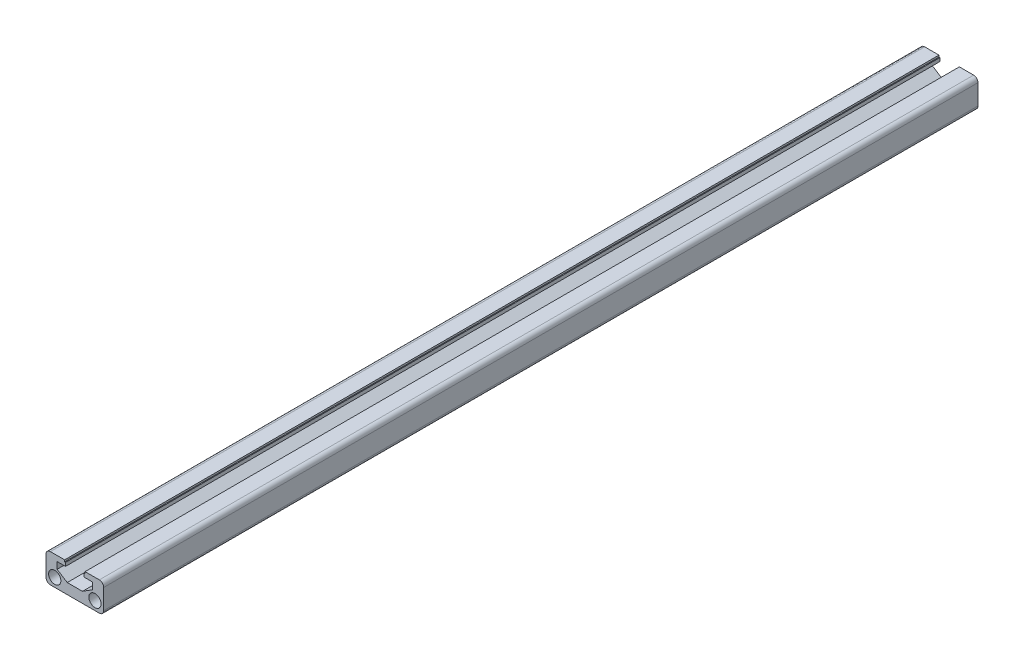
ISO-10303-21;
HEADER;
FILE_DESCRIPTION(('STEP AP214'),'2;1');
FILE_NAME('part.step','',(''),(''),'','','');
FILE_SCHEMA(('AUTOMOTIVE_DESIGN { 1 0 10303 214 1 1 1 1 }'));
ENDSEC;
DATA;
#1=APPLICATION_CONTEXT('core data for automotive mechanical design processes');
#2=APPLICATION_PROTOCOL_DEFINITION('international standard','automotive_design',2000,#1);
#3=PRODUCT_CONTEXT('',#1,'mechanical');
#4=PRODUCT('Part','Part','',(#3));
#5=PRODUCT_RELATED_PRODUCT_CATEGORY('part','',(#4));
#6=PRODUCT_DEFINITION_FORMATION('','',#4);
#7=PRODUCT_DEFINITION_CONTEXT('part definition',#1,'design');
#8=PRODUCT_DEFINITION('design','',#6,#7);
#9=PRODUCT_DEFINITION_SHAPE('','',#8);
#10=(LENGTH_UNIT() NAMED_UNIT(*) SI_UNIT(.MILLI.,.METRE.));
#11=(NAMED_UNIT(*) PLANE_ANGLE_UNIT() SI_UNIT($,.RADIAN.));
#12=(NAMED_UNIT(*) SI_UNIT($,.STERADIAN.) SOLID_ANGLE_UNIT());
#13=UNCERTAINTY_MEASURE_WITH_UNIT(LENGTH_MEASURE(1.E-05),#10,'distance_accuracy_value','');
#14=(GEOMETRIC_REPRESENTATION_CONTEXT(3) GLOBAL_UNCERTAINTY_ASSIGNED_CONTEXT((#13)) GLOBAL_UNIT_ASSIGNED_CONTEXT((#10,
#11,#12)) REPRESENTATION_CONTEXT('',''));
#15=CARTESIAN_POINT('',(0.,0.,0.));
#16=DIRECTION('',(0.,0.,1.));
#17=DIRECTION('',(1.,0.,0.));
#18=AXIS2_PLACEMENT_3D('',#15,#16,#17);
#19=CARTESIAN_POINT('',(8.4,3.45,300.));
#20=DIRECTION('',(0.,0.,-1.));
#21=DIRECTION('',(-1.,0.,0.));
#22=AXIS2_PLACEMENT_3D('',#19,#20,#21);
#23=PLANE('',#22);
#24=DIRECTION('',(-0.844508578449678,0.535542025358332,0.));
#25=VECTOR('',#24,1.);
#26=CARTESIAN_POINT('',(-6.07478831126901,0.842971246006387,300.));
#27=LINE('',#26,#25);
#28=CARTESIAN_POINT('',(-2.61664134641278,-1.35,300.));
#29=VERTEX_POINT('',#28);
#30=CARTESIAN_POINT('',(-6.07478831126901,0.842971246006387,300.));
#31=VERTEX_POINT('',#30);
#32=EDGE_CURVE('E294',#29,#31,#27,.T.);
#33=ORIENTED_EDGE('',*,*,#32,.T.);
#34=DIRECTION('',(0.,1.,0.));
#35=VECTOR('',#34,1.);
#36=CARTESIAN_POINT('',(-6.07478831126901,3.15000000000001,300.));
#37=LINE('',#36,#35);
#38=CARTESIAN_POINT('',(-6.07478831126901,3.15000000000001,300.));
#39=VERTEX_POINT('',#38);
#40=EDGE_CURVE('E146',#31,#39,#37,.T.);
#41=ORIENTED_EDGE('',*,*,#40,.T.);
#42=DIRECTION('',(1.,0.,0.));
#43=VECTOR('',#42,1.);
#44=CARTESIAN_POINT('',(-3.2,3.15000000000001,300.));
#45=LINE('',#44,#43);
#46=CARTESIAN_POINT('',(-3.2,3.15000000000001,300.));
#47=VERTEX_POINT('',#46);
#48=EDGE_CURVE('E371',#39,#47,#45,.T.);
#49=ORIENTED_EDGE('',*,*,#48,.T.);
#50=DIRECTION('',(0.,1.,0.));
#51=VECTOR('',#50,1.);
#52=CARTESIAN_POINT('',(-3.2,4.33849840255591,300.));
#53=LINE('',#52,#51);
#54=CARTESIAN_POINT('',(-3.2,4.33849840255591,300.));
#55=VERTEX_POINT('',#54);
#56=EDGE_CURVE('E391',#47,#55,#53,.T.);
#57=ORIENTED_EDGE('',*,*,#56,.T.);
#58=DIRECTION('',(-1.,0.,0.));
#59=VECTOR('',#58,1.);
#60=CARTESIAN_POINT('',(-3.5,4.33849840255591,300.));
#61=LINE('',#60,#59);
#62=CARTESIAN_POINT('',(-3.5,4.33849840255591,300.));
#63=VERTEX_POINT('',#62);
#64=EDGE_CURVE('E387',#55,#63,#61,.T.);
#65=ORIENTED_EDGE('',*,*,#64,.T.);
#66=DIRECTION('',(0.,1.,0.));
#67=VECTOR('',#66,1.);
#68=CARTESIAN_POINT('',(-3.5,4.95,300.));
#69=LINE('',#68,#67);
#70=CARTESIAN_POINT('',(-3.5,4.95,300.));
#71=VERTEX_POINT('',#70);
#72=EDGE_CURVE('E390',#63,#71,#69,.T.);
#73=ORIENTED_EDGE('',*,*,#72,.T.);
#74=DIRECTION('',(-1.,0.,0.));
#75=VECTOR('',#74,1.);
#76=CARTESIAN_POINT('',(-8.39999999999999,4.95,300.));
#77=LINE('',#76,#75);
#78=CARTESIAN_POINT('',(-8.39999999999999,4.95,300.));
#79=VERTEX_POINT('',#78);
#80=EDGE_CURVE('E395',#71,#79,#77,.T.);
#81=ORIENTED_EDGE('',*,*,#80,.T.);
#82=CARTESIAN_POINT('',(-8.4,3.45,300.));
#83=DIRECTION('',(0.,0.,1.));
#84=DIRECTION('',(-1.,0.,0.));
#85=AXIS2_PLACEMENT_3D('',#82,#83,#84);
#86=CIRCLE('',#85,1.5);
#87=CARTESIAN_POINT('',(-9.9,3.44999999999999,300.));
#88=VERTEX_POINT('',#87);
#89=EDGE_CURVE('E402',#79,#88,#86,.T.);
#90=ORIENTED_EDGE('',*,*,#89,.T.);
#91=DIRECTION('',(0.,-1.,0.));
#92=VECTOR('',#91,1.);
#93=CARTESIAN_POINT('',(-9.9,-3.44999999999999,300.));
#94=LINE('',#93,#92);
#95=CARTESIAN_POINT('',(-9.9,-3.44999999999999,300.));
#96=VERTEX_POINT('',#95);
#97=EDGE_CURVE('E405',#88,#96,#94,.T.);
#98=ORIENTED_EDGE('',*,*,#97,.T.);
#99=CARTESIAN_POINT('',(-8.4,-3.45,300.));
#100=DIRECTION('',(0.,0.,1.));
#101=DIRECTION('',(-1.,0.,0.));
#102=AXIS2_PLACEMENT_3D('',#99,#100,#101);
#103=CIRCLE('',#102,1.5);
#104=CARTESIAN_POINT('',(-8.39999999999999,-4.95,300.));
#105=VERTEX_POINT('',#104);
#106=EDGE_CURVE('E408',#96,#105,#103,.T.);
#107=ORIENTED_EDGE('',*,*,#106,.T.);
#108=DIRECTION('',(1.,0.,0.));
#109=VECTOR('',#108,1.);
#110=CARTESIAN_POINT('',(8.39999999999999,-4.95,300.));
#111=LINE('',#110,#109);
#112=CARTESIAN_POINT('',(8.39999999999999,-4.95,300.));
#113=VERTEX_POINT('',#112);
#114=EDGE_CURVE('E411',#105,#113,#111,.T.);
#115=ORIENTED_EDGE('',*,*,#114,.T.);
#116=CARTESIAN_POINT('',(8.4,-3.45,300.));
#117=DIRECTION('',(0.,0.,1.));
#118=DIRECTION('',(-1.,0.,0.));
#119=AXIS2_PLACEMENT_3D('',#116,#117,#118);
#120=CIRCLE('',#119,1.5);
#121=CARTESIAN_POINT('',(9.9,-3.44999999999999,300.));
#122=VERTEX_POINT('',#121);
#123=EDGE_CURVE('E414',#113,#122,#120,.T.);
#124=ORIENTED_EDGE('',*,*,#123,.T.);
#125=DIRECTION('',(0.,1.,0.));
#126=VECTOR('',#125,1.);
#127=CARTESIAN_POINT('',(9.9,-3.44999999999999,300.));
#128=LINE('',#127,#126);
#129=CARTESIAN_POINT('',(9.9,3.44999999999999,300.));
#130=VERTEX_POINT('',#129);
#131=EDGE_CURVE('E417',#122,#130,#128,.T.);
#132=ORIENTED_EDGE('',*,*,#131,.T.);
#133=CARTESIAN_POINT('',(8.4,3.45,300.));
#134=DIRECTION('',(0.,0.,1.));
#135=DIRECTION('',(-1.,0.,0.));
#136=AXIS2_PLACEMENT_3D('',#133,#134,#135);
#137=CIRCLE('',#136,1.5);
#138=CARTESIAN_POINT('',(8.39999999999999,4.95,300.));
#139=VERTEX_POINT('',#138);
#140=EDGE_CURVE('E420',#130,#139,#137,.T.);
#141=ORIENTED_EDGE('',*,*,#140,.T.);
#142=DIRECTION('',(-1.,0.,0.));
#143=VECTOR('',#142,1.);
#144=CARTESIAN_POINT('',(8.39999999999999,4.95,300.));
#145=LINE('',#144,#143);
#146=CARTESIAN_POINT('',(3.5,4.95,300.));
#147=VERTEX_POINT('',#146);
#148=EDGE_CURVE('E423',#139,#147,#145,.T.);
#149=ORIENTED_EDGE('',*,*,#148,.T.);
#150=DIRECTION('',(0.,-1.,0.));
#151=VECTOR('',#150,1.);
#152=CARTESIAN_POINT('',(3.5,4.95,300.));
#153=LINE('',#152,#151);
#154=CARTESIAN_POINT('',(3.5,4.33849840255591,300.));
#155=VERTEX_POINT('',#154);
#156=EDGE_CURVE('E426',#147,#155,#153,.T.);
#157=ORIENTED_EDGE('',*,*,#156,.T.);
#158=DIRECTION('',(-1.,0.,0.));
#159=VECTOR('',#158,1.);
#160=CARTESIAN_POINT('',(3.5,4.33849840255591,300.));
#161=LINE('',#160,#159);
#162=CARTESIAN_POINT('',(3.2,4.33849840255591,300.));
#163=VERTEX_POINT('',#162);
#164=EDGE_CURVE('E429',#155,#163,#161,.T.);
#165=ORIENTED_EDGE('',*,*,#164,.T.);
#166=DIRECTION('',(0.,-1.,0.));
#167=VECTOR('',#166,1.);
#168=CARTESIAN_POINT('',(3.2,4.33849840255591,300.));
#169=LINE('',#168,#167);
#170=CARTESIAN_POINT('',(3.2,3.15000000000001,300.));
#171=VERTEX_POINT('',#170);
#172=EDGE_CURVE('E432',#163,#171,#169,.T.);
#173=ORIENTED_EDGE('',*,*,#172,.T.);
#174=DIRECTION('',(1.,0.,0.));
#175=VECTOR('',#174,1.);
#176=CARTESIAN_POINT('',(3.2,3.15000000000001,300.));
#177=LINE('',#176,#175);
#178=CARTESIAN_POINT('',(6.07478831126901,3.15000000000001,300.));
#179=VERTEX_POINT('',#178);
#180=EDGE_CURVE('E207',#171,#179,#177,.T.);
#181=ORIENTED_EDGE('',*,*,#180,.T.);
#182=DIRECTION('',(0.,-1.,0.));
#183=VECTOR('',#182,1.);
#184=CARTESIAN_POINT('',(6.07478831126901,3.15000000000001,300.));
#185=LINE('',#184,#183);
#186=CARTESIAN_POINT('',(6.07478831126901,0.842971246006387,300.));
#187=VERTEX_POINT('',#186);
#188=EDGE_CURVE('E201',#179,#187,#185,.T.);
#189=ORIENTED_EDGE('',*,*,#188,.T.);
#190=DIRECTION('',(-0.844508578449678,-0.535542025358332,0.));
#191=VECTOR('',#190,1.);
#192=CARTESIAN_POINT('',(6.07478831126901,0.842971246006387,300.));
#193=LINE('',#192,#191);
#194=CARTESIAN_POINT('',(2.61664134641278,-1.35,300.));
#195=VERTEX_POINT('',#194);
#196=EDGE_CURVE('E205',#187,#195,#193,.T.);
#197=ORIENTED_EDGE('',*,*,#196,.T.);
#198=DIRECTION('',(-1.,0.,0.));
#199=VECTOR('',#198,1.);
#200=CARTESIAN_POINT('',(-2.61664134641278,-1.35,300.));
#201=LINE('',#200,#199);
#202=EDGE_CURVE('E61',#195,#29,#201,.T.);
#203=ORIENTED_EDGE('',*,*,#202,.T.);
#204=EDGE_LOOP('',(#33,#41,#49,#57,#65,#73,#81,#90,#98,#107,#115,#124,#132,#141,#149,#157,#165,
#173,#181,#189,#197,#203));
#205=FACE_BOUND('',#204,.T.);
#206=CARTESIAN_POINT('',(-6.9,-1.95,300.));
#207=DIRECTION('',(0.,0.,1.));
#208=DIRECTION('',(1.,0.,0.));
#209=AXIS2_PLACEMENT_3D('',#206,#207,#208);
#210=CIRCLE('',#209,2.1);
#211=CARTESIAN_POINT('',(-4.8,-1.95,300.));
#212=VERTEX_POINT('',#211);
#213=EDGE_CURVE('E234',#212,#212,#210,.T.);
#214=ORIENTED_EDGE('',*,*,#213,.F.);
#215=EDGE_LOOP('',(#214));
#216=FACE_BOUND('',#215,.T.);
#217=CARTESIAN_POINT('',(6.9,-1.95,300.));
#218=DIRECTION('',(0.,0.,1.));
#219=DIRECTION('',(-1.,0.,0.));
#220=AXIS2_PLACEMENT_3D('',#217,#218,#219);
#221=CIRCLE('',#220,2.1);
#222=CARTESIAN_POINT('',(4.8,-1.95,300.));
#223=VERTEX_POINT('',#222);
#224=EDGE_CURVE('E475',#223,#223,#221,.T.);
#225=ORIENTED_EDGE('',*,*,#224,.F.);
#226=EDGE_LOOP('',(#225));
#227=FACE_BOUND('',#226,.T.);
#228=ADVANCED_FACE('F43',(#205,#216,#227),#23,.F.);
#229=CARTESIAN_POINT('',(8.4,3.45,0.));
#230=DIRECTION('',(0.,0.,-1.));
#231=DIRECTION('',(-1.,0.,0.));
#232=AXIS2_PLACEMENT_3D('',#229,#230,#231);
#233=PLANE('',#232);
#234=CARTESIAN_POINT('',(-6.9,-1.95,0.));
#235=DIRECTION('',(0.,0.,1.));
#236=DIRECTION('',(1.,0.,0.));
#237=AXIS2_PLACEMENT_3D('',#234,#235,#236);
#238=CIRCLE('',#237,2.1);
#239=CARTESIAN_POINT('',(-4.8,-1.95,0.));
#240=VERTEX_POINT('',#239);
#241=EDGE_CURVE('E482',#240,#240,#238,.T.);
#242=ORIENTED_EDGE('',*,*,#241,.T.);
#243=EDGE_LOOP('',(#242));
#244=FACE_BOUND('',#243,.T.);
#245=DIRECTION('',(-0.844508578449678,0.535542025358332,0.));
#246=VECTOR('',#245,1.);
#247=CARTESIAN_POINT('',(-6.07478831126901,0.842971246006387,0.));
#248=LINE('',#247,#246);
#249=CARTESIAN_POINT('',(-2.61664134641278,-1.35,0.));
#250=VERTEX_POINT('',#249);
#251=CARTESIAN_POINT('',(-6.07478831126901,0.842971246006387,0.));
#252=VERTEX_POINT('',#251);
#253=EDGE_CURVE('E229',#250,#252,#248,.T.);
#254=ORIENTED_EDGE('',*,*,#253,.F.);
#255=DIRECTION('',(-1.,0.,0.));
#256=VECTOR('',#255,1.);
#257=CARTESIAN_POINT('',(-2.61664134641278,-1.35,0.));
#258=LINE('',#257,#256);
#259=CARTESIAN_POINT('',(2.61664134641278,-1.35,0.));
#260=VERTEX_POINT('',#259);
#261=EDGE_CURVE('E138',#260,#250,#258,.T.);
#262=ORIENTED_EDGE('',*,*,#261,.F.);
#263=DIRECTION('',(-0.844508578449678,-0.535542025358332,0.));
#264=VECTOR('',#263,1.);
#265=CARTESIAN_POINT('',(6.07478831126901,0.842971246006387,0.));
#266=LINE('',#265,#264);
#267=CARTESIAN_POINT('',(6.07478831126901,0.842971246006387,0.));
#268=VERTEX_POINT('',#267);
#269=EDGE_CURVE('E132',#268,#260,#266,.T.);
#270=ORIENTED_EDGE('',*,*,#269,.F.);
#271=DIRECTION('',(0.,-1.,0.));
#272=VECTOR('',#271,1.);
#273=CARTESIAN_POINT('',(6.07478831126901,3.15000000000001,0.));
#274=LINE('',#273,#272);
#275=CARTESIAN_POINT('',(6.07478831126901,3.15000000000001,0.));
#276=VERTEX_POINT('',#275);
#277=EDGE_CURVE('E216',#276,#268,#274,.T.);
#278=ORIENTED_EDGE('',*,*,#277,.F.);
#279=DIRECTION('',(1.,0.,0.));
#280=VECTOR('',#279,1.);
#281=CARTESIAN_POINT('',(3.2,3.15000000000001,0.));
#282=LINE('',#281,#280);
#283=CARTESIAN_POINT('',(3.2,3.15000000000001,0.));
#284=VERTEX_POINT('',#283);
#285=EDGE_CURVE('E285',#284,#276,#282,.T.);
#286=ORIENTED_EDGE('',*,*,#285,.F.);
#287=DIRECTION('',(0.,-1.,0.));
#288=VECTOR('',#287,1.);
#289=CARTESIAN_POINT('',(3.2,4.33849840255591,0.));
#290=LINE('',#289,#288);
#291=CARTESIAN_POINT('',(3.2,4.33849840255591,0.));
#292=VERTEX_POINT('',#291);
#293=EDGE_CURVE('E282',#292,#284,#290,.T.);
#294=ORIENTED_EDGE('',*,*,#293,.F.);
#295=DIRECTION('',(-1.,0.,0.));
#296=VECTOR('',#295,1.);
#297=CARTESIAN_POINT('',(3.5,4.33849840255591,0.));
#298=LINE('',#297,#296);
#299=CARTESIAN_POINT('',(3.5,4.33849840255591,0.));
#300=VERTEX_POINT('',#299);
#301=EDGE_CURVE('E279',#300,#292,#298,.T.);
#302=ORIENTED_EDGE('',*,*,#301,.F.);
#303=DIRECTION('',(0.,-1.,0.));
#304=VECTOR('',#303,1.);
#305=CARTESIAN_POINT('',(3.5,4.95,0.));
#306=LINE('',#305,#304);
#307=CARTESIAN_POINT('',(3.5,4.95,0.));
#308=VERTEX_POINT('',#307);
#309=EDGE_CURVE('E276',#308,#300,#306,.T.);
#310=ORIENTED_EDGE('',*,*,#309,.F.);
#311=DIRECTION('',(-1.,0.,0.));
#312=VECTOR('',#311,1.);
#313=CARTESIAN_POINT('',(8.39999999999999,4.95,0.));
#314=LINE('',#313,#312);
#315=CARTESIAN_POINT('',(8.39999999999999,4.95,0.));
#316=VERTEX_POINT('',#315);
#317=EDGE_CURVE('E273',#316,#308,#314,.T.);
#318=ORIENTED_EDGE('',*,*,#317,.F.);
#319=CARTESIAN_POINT('',(8.4,3.45,0.));
#320=DIRECTION('',(0.,0.,1.));
#321=DIRECTION('',(-1.,0.,0.));
#322=AXIS2_PLACEMENT_3D('',#319,#320,#321);
#323=CIRCLE('',#322,1.5);
#324=CARTESIAN_POINT('',(9.9,3.44999999999999,0.));
#325=VERTEX_POINT('',#324);
#326=EDGE_CURVE('E270',#325,#316,#323,.T.);
#327=ORIENTED_EDGE('',*,*,#326,.F.);
#328=DIRECTION('',(0.,1.,0.));
#329=VECTOR('',#328,1.);
#330=CARTESIAN_POINT('',(9.9,-3.44999999999999,0.));
#331=LINE('',#330,#329);
#332=CARTESIAN_POINT('',(9.9,-3.44999999999999,0.));
#333=VERTEX_POINT('',#332);
#334=EDGE_CURVE('E267',#333,#325,#331,.T.);
#335=ORIENTED_EDGE('',*,*,#334,.F.);
#336=CARTESIAN_POINT('',(8.4,-3.45,0.));
#337=DIRECTION('',(0.,0.,1.));
#338=DIRECTION('',(-1.,0.,0.));
#339=AXIS2_PLACEMENT_3D('',#336,#337,#338);
#340=CIRCLE('',#339,1.5);
#341=CARTESIAN_POINT('',(8.39999999999999,-4.95,0.));
#342=VERTEX_POINT('',#341);
#343=EDGE_CURVE('E264',#342,#333,#340,.T.);
#344=ORIENTED_EDGE('',*,*,#343,.F.);
#345=DIRECTION('',(1.,0.,0.));
#346=VECTOR('',#345,1.);
#347=CARTESIAN_POINT('',(8.39999999999999,-4.95,0.));
#348=LINE('',#347,#346);
#349=CARTESIAN_POINT('',(-8.39999999999999,-4.95,0.));
#350=VERTEX_POINT('',#349);
#351=EDGE_CURVE('E261',#350,#342,#348,.T.);
#352=ORIENTED_EDGE('',*,*,#351,.F.);
#353=CARTESIAN_POINT('',(-8.4,-3.45,0.));
#354=DIRECTION('',(0.,0.,1.));
#355=DIRECTION('',(-1.,0.,0.));
#356=AXIS2_PLACEMENT_3D('',#353,#354,#355);
#357=CIRCLE('',#356,1.5);
#358=CARTESIAN_POINT('',(-9.9,-3.44999999999999,0.));
#359=VERTEX_POINT('',#358);
#360=EDGE_CURVE('E258',#359,#350,#357,.T.);
#361=ORIENTED_EDGE('',*,*,#360,.F.);
#362=DIRECTION('',(0.,-1.,0.));
#363=VECTOR('',#362,1.);
#364=CARTESIAN_POINT('',(-9.9,-3.44999999999999,0.));
#365=LINE('',#364,#363);
#366=CARTESIAN_POINT('',(-9.9,3.44999999999999,0.));
#367=VERTEX_POINT('',#366);
#368=EDGE_CURVE('E255',#367,#359,#365,.T.);
#369=ORIENTED_EDGE('',*,*,#368,.F.);
#370=CARTESIAN_POINT('',(-8.4,3.45,0.));
#371=DIRECTION('',(0.,0.,1.));
#372=DIRECTION('',(-1.,0.,0.));
#373=AXIS2_PLACEMENT_3D('',#370,#371,#372);
#374=CIRCLE('',#373,1.5);
#375=CARTESIAN_POINT('',(-8.39999999999999,4.95,0.));
#376=VERTEX_POINT('',#375);
#377=EDGE_CURVE('E252',#376,#367,#374,.T.);
#378=ORIENTED_EDGE('',*,*,#377,.F.);
#379=DIRECTION('',(-1.,0.,0.));
#380=VECTOR('',#379,1.);
#381=CARTESIAN_POINT('',(-8.39999999999999,4.95,0.));
#382=LINE('',#381,#380);
#383=CARTESIAN_POINT('',(-3.5,4.95,0.));
#384=VERTEX_POINT('',#383);
#385=EDGE_CURVE('E249',#384,#376,#382,.T.);
#386=ORIENTED_EDGE('',*,*,#385,.F.);
#387=DIRECTION('',(0.,1.,0.));
#388=VECTOR('',#387,1.);
#389=CARTESIAN_POINT('',(-3.5,4.95,0.));
#390=LINE('',#389,#388);
#391=CARTESIAN_POINT('',(-3.5,4.33849840255591,0.));
#392=VERTEX_POINT('',#391);
#393=EDGE_CURVE('E246',#392,#384,#390,.T.);
#394=ORIENTED_EDGE('',*,*,#393,.F.);
#395=DIRECTION('',(-1.,0.,0.));
#396=VECTOR('',#395,1.);
#397=CARTESIAN_POINT('',(-3.5,4.33849840255591,0.));
#398=LINE('',#397,#396);
#399=CARTESIAN_POINT('',(-3.2,4.33849840255591,0.));
#400=VERTEX_POINT('',#399);
#401=EDGE_CURVE('E243',#400,#392,#398,.T.);
#402=ORIENTED_EDGE('',*,*,#401,.F.);
#403=DIRECTION('',(0.,1.,0.));
#404=VECTOR('',#403,1.);
#405=CARTESIAN_POINT('',(-3.2,4.33849840255591,0.));
#406=LINE('',#405,#404);
#407=CARTESIAN_POINT('',(-3.2,3.15000000000001,0.));
#408=VERTEX_POINT('',#407);
#409=EDGE_CURVE('E240',#408,#400,#406,.T.);
#410=ORIENTED_EDGE('',*,*,#409,.F.);
#411=DIRECTION('',(1.,0.,0.));
#412=VECTOR('',#411,1.);
#413=CARTESIAN_POINT('',(-3.2,3.15000000000001,0.));
#414=LINE('',#413,#412);
#415=CARTESIAN_POINT('',(-6.07478831126901,3.15000000000001,0.));
#416=VERTEX_POINT('',#415);
#417=EDGE_CURVE('E237',#416,#408,#414,.T.);
#418=ORIENTED_EDGE('',*,*,#417,.F.);
#419=DIRECTION('',(0.,1.,0.));
#420=VECTOR('',#419,1.);
#421=CARTESIAN_POINT('',(-6.07478831126901,3.15000000000001,0.));
#422=LINE('',#421,#420);
#423=EDGE_CURVE('E233',#252,#416,#422,.T.);
#424=ORIENTED_EDGE('',*,*,#423,.F.);
#425=EDGE_LOOP('',(#254,#262,#270,#278,#286,#294,#302,#310,#318,#327,#335,#344,#352,#361,#369,
#378,#386,#394,#402,#410,#418,#424));
#426=FACE_BOUND('',#425,.T.);
#427=CARTESIAN_POINT('',(6.9,-1.95,0.));
#428=DIRECTION('',(0.,0.,1.));
#429=DIRECTION('',(-1.,0.,0.));
#430=AXIS2_PLACEMENT_3D('',#427,#428,#429);
#431=CIRCLE('',#430,2.1);
#432=CARTESIAN_POINT('',(4.8,-1.95,0.));
#433=VERTEX_POINT('',#432);
#434=EDGE_CURVE('E478',#433,#433,#431,.T.);
#435=ORIENTED_EDGE('',*,*,#434,.T.);
#436=EDGE_LOOP('',(#435));
#437=FACE_BOUND('',#436,.T.);
#438=ADVANCED_FACE('F375',(#244,#426,#437),#233,.T.);
#439=CARTESIAN_POINT('',(-6.07478831126901,0.842971246006387,300.));
#440=DIRECTION('',(-0.535542025358332,-0.844508578449678,0.));
#441=DIRECTION('',(0.844508578449678,-0.535542025358332,0.));
#442=AXIS2_PLACEMENT_3D('',#439,#440,#441);
#443=PLANE('',#442);
#444=ORIENTED_EDGE('',*,*,#253,.T.);
#445=DIRECTION('',(0.,0.,-1.));
#446=VECTOR('',#445,1.);
#447=CARTESIAN_POINT('',(-6.07478831126901,0.842971246006387,300.));
#448=LINE('',#447,#446);
#449=EDGE_CURVE('E11',#31,#252,#448,.T.);
#450=ORIENTED_EDGE('',*,*,#449,.F.);
#451=ORIENTED_EDGE('',*,*,#32,.F.);
#452=DIRECTION('',(0.,0.,-1.));
#453=VECTOR('',#452,1.);
#454=CARTESIAN_POINT('',(-2.61664134641278,-1.35,300.));
#455=LINE('',#454,#453);
#456=EDGE_CURVE('E225',#29,#250,#455,.T.);
#457=ORIENTED_EDGE('',*,*,#456,.T.);
#458=EDGE_LOOP('',(#444,#450,#451,#457));
#459=FACE_BOUND('',#458,.T.);
#460=ADVANCED_FACE('F45',(#459),#443,.F.);
#461=CARTESIAN_POINT('',(-6.07478831126901,3.15000000000001,300.));
#462=DIRECTION('',(-1.,0.,0.));
#463=DIRECTION('',(0.,0.,1.));
#464=AXIS2_PLACEMENT_3D('',#461,#462,#463);
#465=PLANE('',#464);
#466=ORIENTED_EDGE('',*,*,#423,.T.);
#467=DIRECTION('',(0.,0.,-1.));
#468=VECTOR('',#467,1.);
#469=CARTESIAN_POINT('',(-6.07478831126901,3.15000000000001,300.));
#470=LINE('',#469,#468);
#471=EDGE_CURVE('E53',#39,#416,#470,.T.);
#472=ORIENTED_EDGE('',*,*,#471,.F.);
#473=ORIENTED_EDGE('',*,*,#40,.F.);
#474=ORIENTED_EDGE('',*,*,#449,.T.);
#475=EDGE_LOOP('',(#466,#472,#473,#474));
#476=FACE_BOUND('',#475,.T.);
#477=ADVANCED_FACE('F702',(#476),#465,.F.);
#478=CARTESIAN_POINT('',(-3.2,3.15000000000001,300.));
#479=DIRECTION('',(0.,1.,0.));
#480=DIRECTION('',(0.,0.,1.));
#481=AXIS2_PLACEMENT_3D('',#478,#479,#480);
#482=PLANE('',#481);
#483=ORIENTED_EDGE('',*,*,#417,.T.);
#484=DIRECTION('',(0.,0.,-1.));
#485=VECTOR('',#484,1.);
#486=CARTESIAN_POINT('',(-3.2,3.15000000000001,300.));
#487=LINE('',#486,#485);
#488=EDGE_CURVE('E361',#47,#408,#487,.T.);
#489=ORIENTED_EDGE('',*,*,#488,.F.);
#490=ORIENTED_EDGE('',*,*,#48,.F.);
#491=ORIENTED_EDGE('',*,*,#471,.T.);
#492=EDGE_LOOP('',(#483,#489,#490,#491));
#493=FACE_BOUND('',#492,.T.);
#494=ADVANCED_FACE('F369',(#493),#482,.F.);
#495=CARTESIAN_POINT('',(-3.2,4.33849840255591,300.));
#496=DIRECTION('',(-1.,0.,0.));
#497=DIRECTION('',(0.,0.,1.));
#498=AXIS2_PLACEMENT_3D('',#495,#496,#497);
#499=PLANE('',#498);
#500=ORIENTED_EDGE('',*,*,#409,.T.);
#501=DIRECTION('',(0.,0.,-1.));
#502=VECTOR('',#501,1.);
#503=CARTESIAN_POINT('',(-3.2,4.33849840255591,300.));
#504=LINE('',#503,#502);
#505=EDGE_CURVE('E357',#55,#400,#504,.T.);
#506=ORIENTED_EDGE('',*,*,#505,.F.);
#507=ORIENTED_EDGE('',*,*,#56,.F.);
#508=ORIENTED_EDGE('',*,*,#488,.T.);
#509=EDGE_LOOP('',(#500,#506,#507,#508));
#510=FACE_BOUND('',#509,.T.);
#511=ADVANCED_FACE('F381',(#510),#499,.F.);
#512=CARTESIAN_POINT('',(-3.5,4.33849840255591,300.));
#513=DIRECTION('',(0.,-1.,0.));
#514=DIRECTION('',(0.,0.,-1.));
#515=AXIS2_PLACEMENT_3D('',#512,#513,#514);
#516=PLANE('',#515);
#517=ORIENTED_EDGE('',*,*,#401,.T.);
#518=DIRECTION('',(0.,0.,-1.));
#519=VECTOR('',#518,1.);
#520=CARTESIAN_POINT('',(-3.5,4.33849840255591,300.));
#521=LINE('',#520,#519);
#522=EDGE_CURVE('E353',#63,#392,#521,.T.);
#523=ORIENTED_EDGE('',*,*,#522,.F.);
#524=ORIENTED_EDGE('',*,*,#64,.F.);
#525=ORIENTED_EDGE('',*,*,#505,.T.);
#526=EDGE_LOOP('',(#517,#523,#524,#525));
#527=FACE_BOUND('',#526,.T.);
#528=ADVANCED_FACE('F385',(#527),#516,.F.);
#529=CARTESIAN_POINT('',(-3.5,4.95,300.));
#530=DIRECTION('',(-1.,0.,0.));
#531=DIRECTION('',(0.,0.,1.));
#532=AXIS2_PLACEMENT_3D('',#529,#530,#531);
#533=PLANE('',#532);
#534=ORIENTED_EDGE('',*,*,#393,.T.);
#535=DIRECTION('',(0.,0.,-1.));
#536=VECTOR('',#535,1.);
#537=CARTESIAN_POINT('',(-3.5,4.95,300.));
#538=LINE('',#537,#536);
#539=EDGE_CURVE('E349',#71,#384,#538,.T.);
#540=ORIENTED_EDGE('',*,*,#539,.F.);
#541=ORIENTED_EDGE('',*,*,#72,.F.);
#542=ORIENTED_EDGE('',*,*,#522,.T.);
#543=EDGE_LOOP('',(#534,#540,#541,#542));
#544=FACE_BOUND('',#543,.T.);
#545=ADVANCED_FACE('F663',(#544),#533,.F.);
#546=CARTESIAN_POINT('',(-8.39999999999999,4.95,300.));
#547=DIRECTION('',(0.,-1.,0.));
#548=DIRECTION('',(0.,0.,-1.));
#549=AXIS2_PLACEMENT_3D('',#546,#547,#548);
#550=PLANE('',#549);
#551=ORIENTED_EDGE('',*,*,#385,.T.);
#552=DIRECTION('',(0.,0.,-1.));
#553=VECTOR('',#552,1.);
#554=CARTESIAN_POINT('',(-8.39999999999999,4.95,300.));
#555=LINE('',#554,#553);
#556=EDGE_CURVE('E345',#79,#376,#555,.T.);
#557=ORIENTED_EDGE('',*,*,#556,.F.);
#558=ORIENTED_EDGE('',*,*,#80,.F.);
#559=ORIENTED_EDGE('',*,*,#539,.T.);
#560=EDGE_LOOP('',(#551,#557,#558,#559));
#561=FACE_BOUND('',#560,.T.);
#562=ADVANCED_FACE('F652',(#561),#550,.F.);
#563=CARTESIAN_POINT('',(-8.4,3.45,300.));
#564=DIRECTION('',(0.,0.,-1.));
#565=DIRECTION('',(-1.,0.,0.));
#566=AXIS2_PLACEMENT_3D('',#563,#564,#565);
#567=CYLINDRICAL_SURFACE('',#566,1.5);
#568=ORIENTED_EDGE('',*,*,#377,.T.);
#569=DIRECTION('',(0.,0.,-1.));
#570=VECTOR('',#569,1.);
#571=CARTESIAN_POINT('',(-9.9,3.44999999999999,300.));
#572=LINE('',#571,#570);
#573=EDGE_CURVE('E341',#88,#367,#572,.T.);
#574=ORIENTED_EDGE('',*,*,#573,.F.);
#575=ORIENTED_EDGE('',*,*,#89,.F.);
#576=ORIENTED_EDGE('',*,*,#556,.T.);
#577=EDGE_LOOP('',(#568,#574,#575,#576));
#578=FACE_BOUND('',#577,.T.);
#579=ADVANCED_FACE('F641',(#578),#567,.T.);
#580=CARTESIAN_POINT('',(-9.9,-3.44999999999999,300.));
#581=DIRECTION('',(1.,0.,0.));
#582=DIRECTION('',(0.,0.,-1.));
#583=AXIS2_PLACEMENT_3D('',#580,#581,#582);
#584=PLANE('',#583);
#585=ORIENTED_EDGE('',*,*,#368,.T.);
#586=DIRECTION('',(0.,0.,-1.));
#587=VECTOR('',#586,1.);
#588=CARTESIAN_POINT('',(-9.9,-3.44999999999999,300.));
#589=LINE('',#588,#587);
#590=EDGE_CURVE('E337',#96,#359,#589,.T.);
#591=ORIENTED_EDGE('',*,*,#590,.F.);
#592=ORIENTED_EDGE('',*,*,#97,.F.);
#593=ORIENTED_EDGE('',*,*,#573,.T.);
#594=EDGE_LOOP('',(#585,#591,#592,#593));
#595=FACE_BOUND('',#594,.T.);
#596=ADVANCED_FACE('F630',(#595),#584,.F.);
#597=CARTESIAN_POINT('',(-8.4,-3.45,300.));
#598=DIRECTION('',(0.,0.,-1.));
#599=DIRECTION('',(-1.,0.,0.));
#600=AXIS2_PLACEMENT_3D('',#597,#598,#599);
#601=CYLINDRICAL_SURFACE('',#600,1.5);
#602=ORIENTED_EDGE('',*,*,#360,.T.);
#603=DIRECTION('',(0.,0.,-1.));
#604=VECTOR('',#603,1.);
#605=CARTESIAN_POINT('',(-8.39999999999999,-4.95,300.));
#606=LINE('',#605,#604);
#607=EDGE_CURVE('E333',#105,#350,#606,.T.);
#608=ORIENTED_EDGE('',*,*,#607,.F.);
#609=ORIENTED_EDGE('',*,*,#106,.F.);
#610=ORIENTED_EDGE('',*,*,#590,.T.);
#611=EDGE_LOOP('',(#602,#608,#609,#610));
#612=FACE_BOUND('',#611,.T.);
#613=ADVANCED_FACE('F619',(#612),#601,.T.);
#614=CARTESIAN_POINT('',(8.39999999999999,-4.95,300.));
#615=DIRECTION('',(0.,1.,0.));
#616=DIRECTION('',(0.,0.,1.));
#617=AXIS2_PLACEMENT_3D('',#614,#615,#616);
#618=PLANE('',#617);
#619=ORIENTED_EDGE('',*,*,#351,.T.);
#620=DIRECTION('',(0.,0.,-1.));
#621=VECTOR('',#620,1.);
#622=CARTESIAN_POINT('',(8.39999999999999,-4.95,300.));
#623=LINE('',#622,#621);
#624=EDGE_CURVE('E329',#113,#342,#623,.T.);
#625=ORIENTED_EDGE('',*,*,#624,.F.);
#626=ORIENTED_EDGE('',*,*,#114,.F.);
#627=ORIENTED_EDGE('',*,*,#607,.T.);
#628=EDGE_LOOP('',(#619,#625,#626,#627));
#629=FACE_BOUND('',#628,.T.);
#630=ADVANCED_FACE('F608',(#629),#618,.F.);
#631=CARTESIAN_POINT('',(8.4,-3.45,300.));
#632=DIRECTION('',(0.,0.,-1.));
#633=DIRECTION('',(-1.,0.,0.));
#634=AXIS2_PLACEMENT_3D('',#631,#632,#633);
#635=CYLINDRICAL_SURFACE('',#634,1.5);
#636=ORIENTED_EDGE('',*,*,#343,.T.);
#637=DIRECTION('',(0.,0.,-1.));
#638=VECTOR('',#637,1.);
#639=CARTESIAN_POINT('',(9.9,-3.44999999999999,300.));
#640=LINE('',#639,#638);
#641=EDGE_CURVE('E325',#122,#333,#640,.T.);
#642=ORIENTED_EDGE('',*,*,#641,.F.);
#643=ORIENTED_EDGE('',*,*,#123,.F.);
#644=ORIENTED_EDGE('',*,*,#624,.T.);
#645=EDGE_LOOP('',(#636,#642,#643,#644));
#646=FACE_BOUND('',#645,.T.);
#647=ADVANCED_FACE('F597',(#646),#635,.T.);
#648=CARTESIAN_POINT('',(9.9,-3.44999999999999,300.));
#649=DIRECTION('',(-1.,0.,0.));
#650=DIRECTION('',(0.,0.,1.));
#651=AXIS2_PLACEMENT_3D('',#648,#649,#650);
#652=PLANE('',#651);
#653=ORIENTED_EDGE('',*,*,#334,.T.);
#654=DIRECTION('',(0.,0.,-1.));
#655=VECTOR('',#654,1.);
#656=CARTESIAN_POINT('',(9.9,3.44999999999999,300.));
#657=LINE('',#656,#655);
#658=EDGE_CURVE('E321',#130,#325,#657,.T.);
#659=ORIENTED_EDGE('',*,*,#658,.F.);
#660=ORIENTED_EDGE('',*,*,#131,.F.);
#661=ORIENTED_EDGE('',*,*,#641,.T.);
#662=EDGE_LOOP('',(#653,#659,#660,#661));
#663=FACE_BOUND('',#662,.T.);
#664=ADVANCED_FACE('F586',(#663),#652,.F.);
#665=CARTESIAN_POINT('',(8.4,3.45,300.));
#666=DIRECTION('',(0.,0.,-1.));
#667=DIRECTION('',(-1.,0.,0.));
#668=AXIS2_PLACEMENT_3D('',#665,#666,#667);
#669=CYLINDRICAL_SURFACE('',#668,1.5);
#670=ORIENTED_EDGE('',*,*,#326,.T.);
#671=DIRECTION('',(0.,0.,-1.));
#672=VECTOR('',#671,1.);
#673=CARTESIAN_POINT('',(8.39999999999999,4.95,300.));
#674=LINE('',#673,#672);
#675=EDGE_CURVE('E317',#139,#316,#674,.T.);
#676=ORIENTED_EDGE('',*,*,#675,.F.);
#677=ORIENTED_EDGE('',*,*,#140,.F.);
#678=ORIENTED_EDGE('',*,*,#658,.T.);
#679=EDGE_LOOP('',(#670,#676,#677,#678));
#680=FACE_BOUND('',#679,.T.);
#681=ADVANCED_FACE('F575',(#680),#669,.T.);
#682=CARTESIAN_POINT('',(8.39999999999999,4.95,300.));
#683=DIRECTION('',(0.,-1.,0.));
#684=DIRECTION('',(0.,0.,-1.));
#685=AXIS2_PLACEMENT_3D('',#682,#683,#684);
#686=PLANE('',#685);
#687=ORIENTED_EDGE('',*,*,#317,.T.);
#688=DIRECTION('',(0.,0.,-1.));
#689=VECTOR('',#688,1.);
#690=CARTESIAN_POINT('',(3.5,4.95,300.));
#691=LINE('',#690,#689);
#692=EDGE_CURVE('E313',#147,#308,#691,.T.);
#693=ORIENTED_EDGE('',*,*,#692,.F.);
#694=ORIENTED_EDGE('',*,*,#148,.F.);
#695=ORIENTED_EDGE('',*,*,#675,.T.);
#696=EDGE_LOOP('',(#687,#693,#694,#695));
#697=FACE_BOUND('',#696,.T.);
#698=ADVANCED_FACE('F564',(#697),#686,.F.);
#699=CARTESIAN_POINT('',(3.5,4.95,300.));
#700=DIRECTION('',(1.,0.,0.));
#701=DIRECTION('',(0.,0.,-1.));
#702=AXIS2_PLACEMENT_3D('',#699,#700,#701);
#703=PLANE('',#702);
#704=ORIENTED_EDGE('',*,*,#309,.T.);
#705=DIRECTION('',(0.,0.,-1.));
#706=VECTOR('',#705,1.);
#707=CARTESIAN_POINT('',(3.5,4.33849840255591,300.));
#708=LINE('',#707,#706);
#709=EDGE_CURVE('E309',#155,#300,#708,.T.);
#710=ORIENTED_EDGE('',*,*,#709,.F.);
#711=ORIENTED_EDGE('',*,*,#156,.F.);
#712=ORIENTED_EDGE('',*,*,#692,.T.);
#713=EDGE_LOOP('',(#704,#710,#711,#712));
#714=FACE_BOUND('',#713,.T.);
#715=ADVANCED_FACE('F553',(#714),#703,.F.);
#716=CARTESIAN_POINT('',(3.5,4.33849840255591,300.));
#717=DIRECTION('',(0.,-1.,0.));
#718=DIRECTION('',(0.,0.,-1.));
#719=AXIS2_PLACEMENT_3D('',#716,#717,#718);
#720=PLANE('',#719);
#721=ORIENTED_EDGE('',*,*,#301,.T.);
#722=DIRECTION('',(0.,0.,-1.));
#723=VECTOR('',#722,1.);
#724=CARTESIAN_POINT('',(3.2,4.33849840255591,300.));
#725=LINE('',#724,#723);
#726=EDGE_CURVE('E305',#163,#292,#725,.T.);
#727=ORIENTED_EDGE('',*,*,#726,.F.);
#728=ORIENTED_EDGE('',*,*,#164,.F.);
#729=ORIENTED_EDGE('',*,*,#709,.T.);
#730=EDGE_LOOP('',(#721,#727,#728,#729));
#731=FACE_BOUND('',#730,.T.);
#732=ADVANCED_FACE('F543',(#731),#720,.F.);
#733=CARTESIAN_POINT('',(3.2,4.33849840255591,300.));
#734=DIRECTION('',(1.,0.,0.));
#735=DIRECTION('',(0.,0.,-1.));
#736=AXIS2_PLACEMENT_3D('',#733,#734,#735);
#737=PLANE('',#736);
#738=ORIENTED_EDGE('',*,*,#293,.T.);
#739=DIRECTION('',(0.,0.,-1.));
#740=VECTOR('',#739,1.);
#741=CARTESIAN_POINT('',(3.2,3.15000000000001,300.));
#742=LINE('',#741,#740);
#743=EDGE_CURVE('E301',#171,#284,#742,.T.);
#744=ORIENTED_EDGE('',*,*,#743,.F.);
#745=ORIENTED_EDGE('',*,*,#172,.F.);
#746=ORIENTED_EDGE('',*,*,#726,.T.);
#747=EDGE_LOOP('',(#738,#744,#745,#746));
#748=FACE_BOUND('',#747,.T.);
#749=ADVANCED_FACE('F440',(#748),#737,.F.);
#750=CARTESIAN_POINT('',(3.2,3.15000000000001,300.));
#751=DIRECTION('',(0.,1.,0.));
#752=DIRECTION('',(0.,0.,1.));
#753=AXIS2_PLACEMENT_3D('',#750,#751,#752);
#754=PLANE('',#753);
#755=ORIENTED_EDGE('',*,*,#285,.T.);
#756=DIRECTION('',(0.,0.,-1.));
#757=VECTOR('',#756,1.);
#758=CARTESIAN_POINT('',(6.07478831126901,3.15000000000001,300.));
#759=LINE('',#758,#757);
#760=EDGE_CURVE('E218',#179,#276,#759,.T.);
#761=ORIENTED_EDGE('',*,*,#760,.F.);
#762=ORIENTED_EDGE('',*,*,#180,.F.);
#763=ORIENTED_EDGE('',*,*,#743,.T.);
#764=EDGE_LOOP('',(#755,#761,#762,#763));
#765=FACE_BOUND('',#764,.T.);
#766=ADVANCED_FACE('F444',(#765),#754,.F.);
#767=CARTESIAN_POINT('',(6.07478831126901,3.15000000000001,300.));
#768=DIRECTION('',(1.,0.,0.));
#769=DIRECTION('',(0.,0.,-1.));
#770=AXIS2_PLACEMENT_3D('',#767,#768,#769);
#771=PLANE('',#770);
#772=ORIENTED_EDGE('',*,*,#277,.T.);
#773=DIRECTION('',(0.,0.,-1.));
#774=VECTOR('',#773,1.);
#775=CARTESIAN_POINT('',(6.07478831126901,0.842971246006387,300.));
#776=LINE('',#775,#774);
#777=EDGE_CURVE('E213',#187,#268,#776,.T.);
#778=ORIENTED_EDGE('',*,*,#777,.F.);
#779=ORIENTED_EDGE('',*,*,#188,.F.);
#780=ORIENTED_EDGE('',*,*,#760,.T.);
#781=EDGE_LOOP('',(#772,#778,#779,#780));
#782=FACE_BOUND('',#781,.T.);
#783=ADVANCED_FACE('F214',(#782),#771,.F.);
#784=CARTESIAN_POINT('',(6.07478831126901,0.842971246006387,300.));
#785=DIRECTION('',(0.535542025358332,-0.844508578449678,0.));
#786=DIRECTION('',(0.844508578449678,0.535542025358332,0.));
#787=AXIS2_PLACEMENT_3D('',#784,#785,#786);
#788=PLANE('',#787);
#789=ORIENTED_EDGE('',*,*,#269,.T.);
#790=DIRECTION('',(0.,0.,-1.));
#791=VECTOR('',#790,1.);
#792=CARTESIAN_POINT('',(2.61664134641278,-1.35,300.));
#793=LINE('',#792,#791);
#794=EDGE_CURVE('E219',#195,#260,#793,.T.);
#795=ORIENTED_EDGE('',*,*,#794,.F.);
#796=ORIENTED_EDGE('',*,*,#196,.F.);
#797=ORIENTED_EDGE('',*,*,#777,.T.);
#798=EDGE_LOOP('',(#789,#795,#796,#797));
#799=FACE_BOUND('',#798,.T.);
#800=ADVANCED_FACE('F221',(#799),#788,.F.);
#801=CARTESIAN_POINT('',(-2.61664134641278,-1.35,300.));
#802=DIRECTION('',(0.,-1.,0.));
#803=DIRECTION('',(0.,0.,-1.));
#804=AXIS2_PLACEMENT_3D('',#801,#802,#803);
#805=PLANE('',#804);
#806=ORIENTED_EDGE('',*,*,#261,.T.);
#807=ORIENTED_EDGE('',*,*,#456,.F.);
#808=ORIENTED_EDGE('',*,*,#202,.F.);
#809=ORIENTED_EDGE('',*,*,#794,.T.);
#810=EDGE_LOOP('',(#806,#807,#808,#809));
#811=FACE_BOUND('',#810,.T.);
#812=ADVANCED_FACE('F448',(#811),#805,.F.);
#813=CARTESIAN_POINT('',(-6.9,-1.95,300.));
#814=DIRECTION('',(0.,0.,-1.));
#815=DIRECTION('',(-1.,0.,0.));
#816=AXIS2_PLACEMENT_3D('',#813,#814,#815);
#817=CYLINDRICAL_SURFACE('',#816,2.1);
#818=ORIENTED_EDGE('',*,*,#213,.T.);
#819=EDGE_LOOP('',(#818));
#820=FACE_BOUND('',#819,.T.);
#821=ORIENTED_EDGE('',*,*,#241,.F.);
#822=EDGE_LOOP('',(#821));
#823=FACE_BOUND('',#822,.T.);
#824=ADVANCED_FACE('F450',(#820,#823),#817,.F.);
#825=CARTESIAN_POINT('',(6.9,-1.95,300.));
#826=DIRECTION('',(0.,0.,-1.));
#827=DIRECTION('',(-1.,0.,0.));
#828=AXIS2_PLACEMENT_3D('',#825,#826,#827);
#829=CYLINDRICAL_SURFACE('',#828,2.1);
#830=ORIENTED_EDGE('',*,*,#224,.T.);
#831=EDGE_LOOP('',(#830));
#832=FACE_BOUND('',#831,.T.);
#833=ORIENTED_EDGE('',*,*,#434,.F.);
#834=EDGE_LOOP('',(#833));
#835=FACE_BOUND('',#834,.T.);
#836=ADVANCED_FACE('F456',(#832,#835),#829,.F.);
#837=CLOSED_SHELL('',(#228,#438,#460,#477,#494,#511,#528,#545,#562,#579,#596,#613,#630,#647,
#664,#681,#698,#715,#732,#749,#766,#783,#800,#812,#824,#836));
#838=MANIFOLD_SOLID_BREP('B2',#837);
#839=ADVANCED_BREP_SHAPE_REPRESENTATION('',(#18,#838),#14);
#840=SHAPE_DEFINITION_REPRESENTATION(#9,#839);
ENDSEC;
END-ISO-10303-21;
